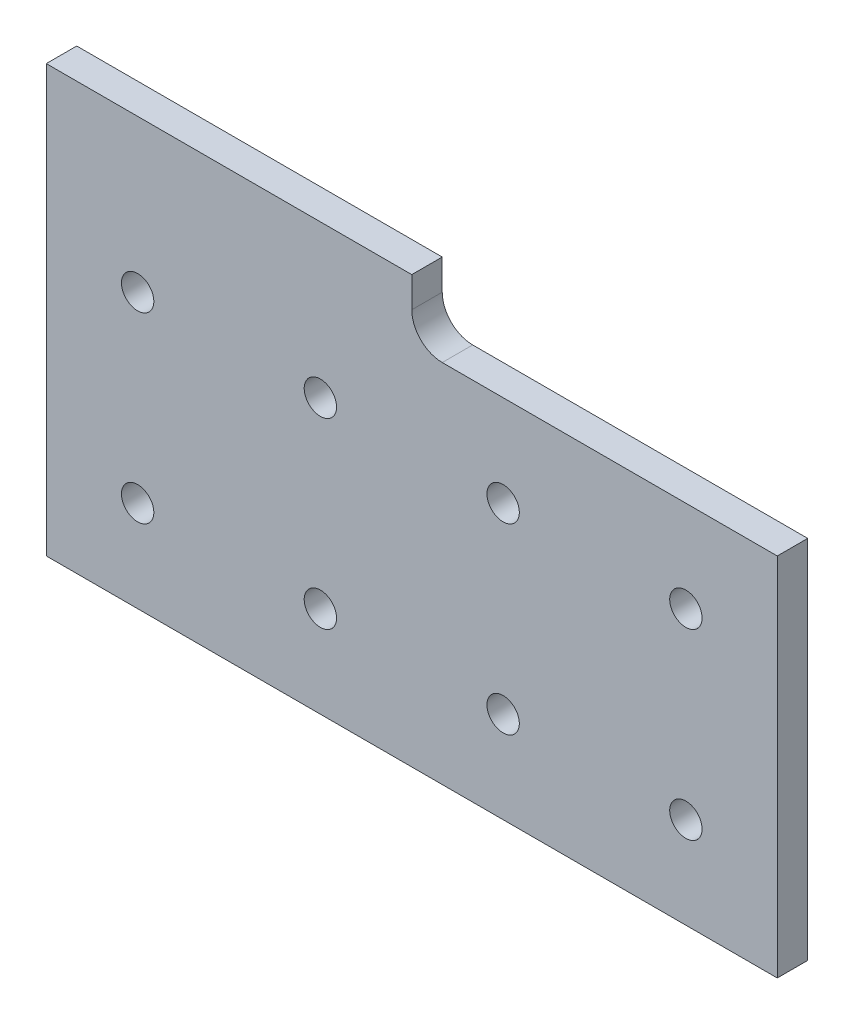
ISO-10303-21;
HEADER;
FILE_DESCRIPTION(('STEP AP214'),'2;1');
FILE_NAME('part.step','',(''),(''),'','','');
FILE_SCHEMA(('AUTOMOTIVE_DESIGN { 1 0 10303 214 1 1 1 1 }'));
ENDSEC;
DATA;
#1=APPLICATION_CONTEXT('core data for automotive mechanical design processes');
#2=APPLICATION_PROTOCOL_DEFINITION('international standard','automotive_design',2000,#1);
#3=PRODUCT_CONTEXT('',#1,'mechanical');
#4=PRODUCT('Part','Part','',(#3));
#5=PRODUCT_RELATED_PRODUCT_CATEGORY('part','',(#4));
#6=PRODUCT_DEFINITION_FORMATION('','',#4);
#7=PRODUCT_DEFINITION_CONTEXT('part definition',#1,'design');
#8=PRODUCT_DEFINITION('design','',#6,#7);
#9=PRODUCT_DEFINITION_SHAPE('','',#8);
#10=(LENGTH_UNIT() NAMED_UNIT(*) SI_UNIT(.MILLI.,.METRE.));
#11=(NAMED_UNIT(*) PLANE_ANGLE_UNIT() SI_UNIT($,.RADIAN.));
#12=(NAMED_UNIT(*) SI_UNIT($,.STERADIAN.) SOLID_ANGLE_UNIT());
#13=UNCERTAINTY_MEASURE_WITH_UNIT(LENGTH_MEASURE(1.E-05),#10,'distance_accuracy_value','');
#14=(GEOMETRIC_REPRESENTATION_CONTEXT(3) GLOBAL_UNCERTAINTY_ASSIGNED_CONTEXT((#13)) GLOBAL_UNIT_ASSIGNED_CONTEXT((#10,
#11,#12)) REPRESENTATION_CONTEXT('',''));
#15=CARTESIAN_POINT('',(0.,0.,0.));
#16=DIRECTION('',(0.,0.,1.));
#17=DIRECTION('',(1.,0.,0.));
#18=AXIS2_PLACEMENT_3D('',#15,#16,#17);
#19=CARTESIAN_POINT('',(133.35,57.15,6.35));
#20=DIRECTION('',(0.,0.,1.));
#21=DIRECTION('',(1.,0.,0.));
#22=AXIS2_PLACEMENT_3D('',#19,#20,#21);
#23=CYLINDRICAL_SURFACE('',#22,3.373501);
#24=CARTESIAN_POINT('',(133.35,57.15,0.));
#25=DIRECTION('',(0.,0.,1.));
#26=DIRECTION('',(1.,0.,0.));
#27=AXIS2_PLACEMENT_3D('',#24,#25,#26);
#28=CIRCLE('',#27,3.373501);
#29=CARTESIAN_POINT('',(136.723501,57.15,0.));
#30=VERTEX_POINT('',#29);
#31=EDGE_CURVE('E192',#30,#30,#28,.T.);
#32=ORIENTED_EDGE('',*,*,#31,.F.);
#33=EDGE_LOOP('',(#32));
#34=FACE_BOUND('',#33,.T.);
#35=CARTESIAN_POINT('',(133.35,57.15,6.35));
#36=DIRECTION('',(0.,0.,1.));
#37=DIRECTION('',(1.,0.,0.));
#38=AXIS2_PLACEMENT_3D('',#35,#36,#37);
#39=CIRCLE('',#38,3.373501);
#40=CARTESIAN_POINT('',(136.723501,57.15,6.35));
#41=VERTEX_POINT('',#40);
#42=EDGE_CURVE('E196',#41,#41,#39,.T.);
#43=ORIENTED_EDGE('',*,*,#42,.T.);
#44=EDGE_LOOP('',(#43));
#45=FACE_BOUND('',#44,.T.);
#46=ADVANCED_FACE('F43',(#34,#45),#23,.F.);
#47=CARTESIAN_POINT('',(95.25,57.15,6.35));
#48=DIRECTION('',(0.,0.,1.));
#49=DIRECTION('',(1.,0.,0.));
#50=AXIS2_PLACEMENT_3D('',#47,#48,#49);
#51=CYLINDRICAL_SURFACE('',#50,3.373501);
#52=CARTESIAN_POINT('',(95.25,57.15,0.));
#53=DIRECTION('',(0.,0.,1.));
#54=DIRECTION('',(1.,0.,0.));
#55=AXIS2_PLACEMENT_3D('',#52,#53,#54);
#56=CIRCLE('',#55,3.373501);
#57=CARTESIAN_POINT('',(98.623501,57.15,0.));
#58=VERTEX_POINT('',#57);
#59=EDGE_CURVE('E184',#58,#58,#56,.T.);
#60=ORIENTED_EDGE('',*,*,#59,.F.);
#61=EDGE_LOOP('',(#60));
#62=FACE_BOUND('',#61,.T.);
#63=CARTESIAN_POINT('',(95.25,57.15,6.35));
#64=DIRECTION('',(0.,0.,1.));
#65=DIRECTION('',(1.,0.,0.));
#66=AXIS2_PLACEMENT_3D('',#63,#64,#65);
#67=CIRCLE('',#66,3.373501);
#68=CARTESIAN_POINT('',(98.623501,57.15,6.35));
#69=VERTEX_POINT('',#68);
#70=EDGE_CURVE('E188',#69,#69,#67,.T.);
#71=ORIENTED_EDGE('',*,*,#70,.T.);
#72=EDGE_LOOP('',(#71));
#73=FACE_BOUND('',#72,.T.);
#74=ADVANCED_FACE('F304',(#62,#73),#51,.F.);
#75=CARTESIAN_POINT('',(57.15,57.15,6.35));
#76=DIRECTION('',(0.,0.,1.));
#77=DIRECTION('',(1.,0.,0.));
#78=AXIS2_PLACEMENT_3D('',#75,#76,#77);
#79=CYLINDRICAL_SURFACE('',#78,3.373501);
#80=CARTESIAN_POINT('',(57.15,57.15,0.));
#81=DIRECTION('',(0.,0.,1.));
#82=DIRECTION('',(1.,0.,0.));
#83=AXIS2_PLACEMENT_3D('',#80,#81,#82);
#84=CIRCLE('',#83,3.373501);
#85=CARTESIAN_POINT('',(60.523501,57.15,0.));
#86=VERTEX_POINT('',#85);
#87=EDGE_CURVE('E176',#86,#86,#84,.T.);
#88=ORIENTED_EDGE('',*,*,#87,.F.);
#89=EDGE_LOOP('',(#88));
#90=FACE_BOUND('',#89,.T.);
#91=CARTESIAN_POINT('',(57.15,57.15,6.35));
#92=DIRECTION('',(0.,0.,1.));
#93=DIRECTION('',(1.,0.,0.));
#94=AXIS2_PLACEMENT_3D('',#91,#92,#93);
#95=CIRCLE('',#94,3.373501);
#96=CARTESIAN_POINT('',(60.523501,57.15,6.35));
#97=VERTEX_POINT('',#96);
#98=EDGE_CURVE('E180',#97,#97,#95,.T.);
#99=ORIENTED_EDGE('',*,*,#98,.T.);
#100=EDGE_LOOP('',(#99));
#101=FACE_BOUND('',#100,.T.);
#102=ADVANCED_FACE('F309',(#90,#101),#79,.F.);
#103=CARTESIAN_POINT('',(19.05,57.15,6.35));
#104=DIRECTION('',(0.,0.,1.));
#105=DIRECTION('',(1.,0.,0.));
#106=AXIS2_PLACEMENT_3D('',#103,#104,#105);
#107=CYLINDRICAL_SURFACE('',#106,3.373501);
#108=CARTESIAN_POINT('',(19.05,57.15,0.));
#109=DIRECTION('',(0.,0.,1.));
#110=DIRECTION('',(1.,0.,0.));
#111=AXIS2_PLACEMENT_3D('',#108,#109,#110);
#112=CIRCLE('',#111,3.373501);
#113=CARTESIAN_POINT('',(22.423501,57.15,0.));
#114=VERTEX_POINT('',#113);
#115=EDGE_CURVE('E168',#114,#114,#112,.T.);
#116=ORIENTED_EDGE('',*,*,#115,.F.);
#117=EDGE_LOOP('',(#116));
#118=FACE_BOUND('',#117,.T.);
#119=CARTESIAN_POINT('',(19.05,57.15,6.35));
#120=DIRECTION('',(0.,0.,1.));
#121=DIRECTION('',(1.,0.,0.));
#122=AXIS2_PLACEMENT_3D('',#119,#120,#121);
#123=CIRCLE('',#122,3.373501);
#124=CARTESIAN_POINT('',(22.423501,57.15,6.35));
#125=VERTEX_POINT('',#124);
#126=EDGE_CURVE('E172',#125,#125,#123,.T.);
#127=ORIENTED_EDGE('',*,*,#126,.T.);
#128=EDGE_LOOP('',(#127));
#129=FACE_BOUND('',#128,.T.);
#130=ADVANCED_FACE('F316',(#118,#129),#107,.F.);
#131=CARTESIAN_POINT('',(133.35,19.05,6.35));
#132=DIRECTION('',(0.,0.,1.));
#133=DIRECTION('',(1.,0.,0.));
#134=AXIS2_PLACEMENT_3D('',#131,#132,#133);
#135=CYLINDRICAL_SURFACE('',#134,3.373501);
#136=CARTESIAN_POINT('',(133.35,19.05,0.));
#137=DIRECTION('',(0.,0.,1.));
#138=DIRECTION('',(1.,0.,0.));
#139=AXIS2_PLACEMENT_3D('',#136,#137,#138);
#140=CIRCLE('',#139,3.373501);
#141=CARTESIAN_POINT('',(136.723501,19.05,0.));
#142=VERTEX_POINT('',#141);
#143=EDGE_CURVE('E160',#142,#142,#140,.T.);
#144=ORIENTED_EDGE('',*,*,#143,.F.);
#145=EDGE_LOOP('',(#144));
#146=FACE_BOUND('',#145,.T.);
#147=CARTESIAN_POINT('',(133.35,19.05,6.35));
#148=DIRECTION('',(0.,0.,1.));
#149=DIRECTION('',(1.,0.,0.));
#150=AXIS2_PLACEMENT_3D('',#147,#148,#149);
#151=CIRCLE('',#150,3.373501);
#152=CARTESIAN_POINT('',(136.723501,19.05,6.35));
#153=VERTEX_POINT('',#152);
#154=EDGE_CURVE('E164',#153,#153,#151,.T.);
#155=ORIENTED_EDGE('',*,*,#154,.T.);
#156=EDGE_LOOP('',(#155));
#157=FACE_BOUND('',#156,.T.);
#158=ADVANCED_FACE('F320',(#146,#157),#135,.F.);
#159=CARTESIAN_POINT('',(95.25,19.05,6.35));
#160=DIRECTION('',(0.,0.,1.));
#161=DIRECTION('',(1.,0.,0.));
#162=AXIS2_PLACEMENT_3D('',#159,#160,#161);
#163=CYLINDRICAL_SURFACE('',#162,3.373501);
#164=CARTESIAN_POINT('',(95.25,19.05,0.));
#165=DIRECTION('',(0.,0.,1.));
#166=DIRECTION('',(1.,0.,0.));
#167=AXIS2_PLACEMENT_3D('',#164,#165,#166);
#168=CIRCLE('',#167,3.373501);
#169=CARTESIAN_POINT('',(98.623501,19.05,0.));
#170=VERTEX_POINT('',#169);
#171=EDGE_CURVE('E152',#170,#170,#168,.T.);
#172=ORIENTED_EDGE('',*,*,#171,.F.);
#173=EDGE_LOOP('',(#172));
#174=FACE_BOUND('',#173,.T.);
#175=CARTESIAN_POINT('',(95.25,19.05,6.35));
#176=DIRECTION('',(0.,0.,1.));
#177=DIRECTION('',(1.,0.,0.));
#178=AXIS2_PLACEMENT_3D('',#175,#176,#177);
#179=CIRCLE('',#178,3.373501);
#180=CARTESIAN_POINT('',(98.623501,19.05,6.35));
#181=VERTEX_POINT('',#180);
#182=EDGE_CURVE('E156',#181,#181,#179,.T.);
#183=ORIENTED_EDGE('',*,*,#182,.T.);
#184=EDGE_LOOP('',(#183));
#185=FACE_BOUND('',#184,.T.);
#186=ADVANCED_FACE('F324',(#174,#185),#163,.F.);
#187=CARTESIAN_POINT('',(0.,88.9,6.35));
#188=DIRECTION('',(1.,0.,0.));
#189=DIRECTION('',(0.,0.,-1.));
#190=AXIS2_PLACEMENT_3D('',#187,#188,#189);
#191=PLANE('',#190);
#192=DIRECTION('',(0.,-1.,0.));
#193=VECTOR('',#192,1.);
#194=CARTESIAN_POINT('',(0.,88.9,0.));
#195=LINE('',#194,#193);
#196=CARTESIAN_POINT('',(0.,88.9,0.));
#197=VERTEX_POINT('',#196);
#198=CARTESIAN_POINT('',(0.,0.,0.));
#199=VERTEX_POINT('',#198);
#200=EDGE_CURVE('E125',#197,#199,#195,.T.);
#201=ORIENTED_EDGE('',*,*,#200,.T.);
#202=DIRECTION('',(0.,0.,-1.));
#203=VECTOR('',#202,1.);
#204=CARTESIAN_POINT('',(0.,0.,6.35));
#205=LINE('',#204,#203);
#206=CARTESIAN_POINT('',(0.,0.,6.35));
#207=VERTEX_POINT('',#206);
#208=EDGE_CURVE('E148',#207,#199,#205,.T.);
#209=ORIENTED_EDGE('',*,*,#208,.F.);
#210=DIRECTION('',(0.,-1.,0.));
#211=VECTOR('',#210,1.);
#212=CARTESIAN_POINT('',(0.,88.9,6.35));
#213=LINE('',#212,#211);
#214=CARTESIAN_POINT('',(0.,88.9,6.35));
#215=VERTEX_POINT('',#214);
#216=EDGE_CURVE('E127',#215,#207,#213,.T.);
#217=ORIENTED_EDGE('',*,*,#216,.F.);
#218=DIRECTION('',(0.,0.,-1.));
#219=VECTOR('',#218,1.);
#220=CARTESIAN_POINT('',(0.,88.9,6.35));
#221=LINE('',#220,#219);
#222=EDGE_CURVE('E141',#215,#197,#221,.T.);
#223=ORIENTED_EDGE('',*,*,#222,.T.);
#224=EDGE_LOOP('',(#201,#209,#217,#223));
#225=FACE_BOUND('',#224,.T.);
#226=ADVANCED_FACE('F328',(#225),#191,.F.);
#227=CARTESIAN_POINT('',(0.,0.,6.35));
#228=DIRECTION('',(0.,1.,0.));
#229=DIRECTION('',(0.,0.,1.));
#230=AXIS2_PLACEMENT_3D('',#227,#228,#229);
#231=PLANE('',#230);
#232=DIRECTION('',(1.,0.,0.));
#233=VECTOR('',#232,1.);
#234=CARTESIAN_POINT('',(0.,0.,0.));
#235=LINE('',#234,#233);
#236=CARTESIAN_POINT('',(152.4,0.,0.));
#237=VERTEX_POINT('',#236);
#238=EDGE_CURVE('E137',#199,#237,#235,.T.);
#239=ORIENTED_EDGE('',*,*,#238,.T.);
#240=DIRECTION('',(0.,0.,-1.));
#241=VECTOR('',#240,1.);
#242=CARTESIAN_POINT('',(152.4,0.,6.35));
#243=LINE('',#242,#241);
#244=CARTESIAN_POINT('',(152.4,0.,6.35));
#245=VERTEX_POINT('',#244);
#246=EDGE_CURVE('E144',#245,#237,#243,.T.);
#247=ORIENTED_EDGE('',*,*,#246,.F.);
#248=DIRECTION('',(1.,0.,0.));
#249=VECTOR('',#248,1.);
#250=CARTESIAN_POINT('',(0.,0.,6.35));
#251=LINE('',#250,#249);
#252=EDGE_CURVE('E134',#207,#245,#251,.T.);
#253=ORIENTED_EDGE('',*,*,#252,.F.);
#254=ORIENTED_EDGE('',*,*,#208,.T.);
#255=EDGE_LOOP('',(#239,#247,#253,#254));
#256=FACE_BOUND('',#255,.T.);
#257=ADVANCED_FACE('F245',(#256),#231,.F.);
#258=CARTESIAN_POINT('',(152.4,0.,6.35));
#259=DIRECTION('',(-1.,0.,0.));
#260=DIRECTION('',(0.,0.,1.));
#261=AXIS2_PLACEMENT_3D('',#258,#259,#260);
#262=PLANE('',#261);
#263=DIRECTION('',(0.,1.,0.));
#264=VECTOR('',#263,1.);
#265=CARTESIAN_POINT('',(152.4,0.,0.));
#266=LINE('',#265,#264);
#267=CARTESIAN_POINT('',(152.4,76.2,0.));
#268=VERTEX_POINT('',#267);
#269=EDGE_CURVE('E128',#237,#268,#266,.T.);
#270=ORIENTED_EDGE('',*,*,#269,.T.);
#271=DIRECTION('',(0.,0.,1.));
#272=VECTOR('',#271,1.);
#273=CARTESIAN_POINT('',(152.4,76.2,0.));
#274=LINE('',#273,#272);
#275=CARTESIAN_POINT('',(152.4,76.2,6.35));
#276=VERTEX_POINT('',#275);
#277=EDGE_CURVE('E119',#268,#276,#274,.T.);
#278=ORIENTED_EDGE('',*,*,#277,.T.);
#279=DIRECTION('',(0.,1.,0.));
#280=VECTOR('',#279,1.);
#281=CARTESIAN_POINT('',(152.4,0.,6.35));
#282=LINE('',#281,#280);
#283=EDGE_CURVE('E228',#245,#276,#282,.T.);
#284=ORIENTED_EDGE('',*,*,#283,.F.);
#285=ORIENTED_EDGE('',*,*,#246,.T.);
#286=EDGE_LOOP('',(#270,#278,#284,#285));
#287=FACE_BOUND('',#286,.T.);
#288=ADVANCED_FACE('F250',(#287),#262,.F.);
#289=CARTESIAN_POINT('',(152.4,88.9,6.35));
#290=DIRECTION('',(0.,-1.,0.));
#291=DIRECTION('',(1.,0.,0.));
#292=AXIS2_PLACEMENT_3D('',#289,#290,#291);
#293=PLANE('',#292);
#294=DIRECTION('',(-1.,0.,0.));
#295=VECTOR('',#294,1.);
#296=CARTESIAN_POINT('',(152.4,88.9,6.35));
#297=LINE('',#296,#295);
#298=CARTESIAN_POINT('',(76.2,88.9,6.35));
#299=VERTEX_POINT('',#298);
#300=EDGE_CURVE('E116',#299,#215,#297,.T.);
#301=ORIENTED_EDGE('',*,*,#300,.F.);
#302=DIRECTION('',(0.,0.,1.));
#303=VECTOR('',#302,1.);
#304=CARTESIAN_POINT('',(76.2,88.9,0.));
#305=LINE('',#304,#303);
#306=CARTESIAN_POINT('',(76.2,88.9,0.));
#307=VERTEX_POINT('',#306);
#308=EDGE_CURVE('E102',#307,#299,#305,.T.);
#309=ORIENTED_EDGE('',*,*,#308,.F.);
#310=DIRECTION('',(-1.,0.,0.));
#311=VECTOR('',#310,1.);
#312=CARTESIAN_POINT('',(152.4,88.9,0.));
#313=LINE('',#312,#311);
#314=EDGE_CURVE('E114',#307,#197,#313,.T.);
#315=ORIENTED_EDGE('',*,*,#314,.T.);
#316=ORIENTED_EDGE('',*,*,#222,.F.);
#317=EDGE_LOOP('',(#301,#309,#315,#316));
#318=FACE_BOUND('',#317,.T.);
#319=ADVANCED_FACE('F112',(#318),#293,.F.);
#320=CARTESIAN_POINT('',(0.,0.,6.35));
#321=DIRECTION('',(0.,0.,1.));
#322=DIRECTION('',(1.,0.,0.));
#323=AXIS2_PLACEMENT_3D('',#320,#321,#322);
#324=PLANE('',#323);
#325=DIRECTION('',(0.,-1.,0.));
#326=VECTOR('',#325,1.);
#327=CARTESIAN_POINT('',(76.2,88.9,6.35));
#328=LINE('',#327,#326);
#329=CARTESIAN_POINT('',(76.2,82.55,6.35));
#330=VERTEX_POINT('',#329);
#331=EDGE_CURVE('E356',#299,#330,#328,.T.);
#332=ORIENTED_EDGE('',*,*,#331,.F.);
#333=ORIENTED_EDGE('',*,*,#300,.T.);
#334=ORIENTED_EDGE('',*,*,#216,.T.);
#335=ORIENTED_EDGE('',*,*,#252,.T.);
#336=ORIENTED_EDGE('',*,*,#283,.T.);
#337=DIRECTION('',(1.,0.,0.));
#338=VECTOR('',#337,1.);
#339=CARTESIAN_POINT('',(76.2,76.2,6.35));
#340=LINE('',#339,#338);
#341=CARTESIAN_POINT('',(82.55,76.2,6.35));
#342=VERTEX_POINT('',#341);
#343=EDGE_CURVE('E108',#342,#276,#340,.T.);
#344=ORIENTED_EDGE('',*,*,#343,.F.);
#345=CARTESIAN_POINT('',(82.55,82.55,6.35));
#346=DIRECTION('',(0.,0.,1.));
#347=DIRECTION('',(1.,0.,0.));
#348=AXIS2_PLACEMENT_3D('',#345,#346,#347);
#349=CIRCLE('',#348,6.35);
#350=EDGE_CURVE('E52',#342,#330,#349,.F.);
#351=ORIENTED_EDGE('',*,*,#350,.T.);
#352=EDGE_LOOP('',(#332,#333,#334,#335,#336,#344,#351));
#353=FACE_BOUND('',#352,.T.);
#354=CARTESIAN_POINT('',(57.15,19.05,6.35));
#355=DIRECTION('',(0.,0.,1.));
#356=DIRECTION('',(1.,0.,0.));
#357=AXIS2_PLACEMENT_3D('',#354,#355,#356);
#358=CIRCLE('',#357,3.373501);
#359=CARTESIAN_POINT('',(60.523501,19.05,6.35));
#360=VERTEX_POINT('',#359);
#361=EDGE_CURVE('E267',#360,#360,#358,.T.);
#362=ORIENTED_EDGE('',*,*,#361,.F.);
#363=EDGE_LOOP('',(#362));
#364=FACE_BOUND('',#363,.T.);
#365=CARTESIAN_POINT('',(19.05,19.05,6.35));
#366=DIRECTION('',(0.,0.,1.));
#367=DIRECTION('',(1.,0.,0.));
#368=AXIS2_PLACEMENT_3D('',#365,#366,#367);
#369=CIRCLE('',#368,3.373501);
#370=CARTESIAN_POINT('',(22.423501,19.05,6.35));
#371=VERTEX_POINT('',#370);
#372=EDGE_CURVE('E271',#371,#371,#369,.T.);
#373=ORIENTED_EDGE('',*,*,#372,.F.);
#374=EDGE_LOOP('',(#373));
#375=FACE_BOUND('',#374,.T.);
#376=ORIENTED_EDGE('',*,*,#182,.F.);
#377=EDGE_LOOP('',(#376));
#378=FACE_BOUND('',#377,.T.);
#379=ORIENTED_EDGE('',*,*,#154,.F.);
#380=EDGE_LOOP('',(#379));
#381=FACE_BOUND('',#380,.T.);
#382=ORIENTED_EDGE('',*,*,#126,.F.);
#383=EDGE_LOOP('',(#382));
#384=FACE_BOUND('',#383,.T.);
#385=ORIENTED_EDGE('',*,*,#98,.F.);
#386=EDGE_LOOP('',(#385));
#387=FACE_BOUND('',#386,.T.);
#388=ORIENTED_EDGE('',*,*,#70,.F.);
#389=EDGE_LOOP('',(#388));
#390=FACE_BOUND('',#389,.T.);
#391=ORIENTED_EDGE('',*,*,#42,.F.);
#392=EDGE_LOOP('',(#391));
#393=FACE_BOUND('',#392,.T.);
#394=ADVANCED_FACE('F287',(#353,#364,#375,#378,#381,#384,#387,#390,#393),#324,.T.);
#395=CARTESIAN_POINT('',(0.,0.,0.));
#396=DIRECTION('',(0.,0.,1.));
#397=DIRECTION('',(1.,0.,0.));
#398=AXIS2_PLACEMENT_3D('',#395,#396,#397);
#399=PLANE('',#398);
#400=CARTESIAN_POINT('',(57.15,19.05,0.));
#401=DIRECTION('',(0.,0.,1.));
#402=DIRECTION('',(1.,0.,0.));
#403=AXIS2_PLACEMENT_3D('',#400,#401,#402);
#404=CIRCLE('',#403,3.373501);
#405=CARTESIAN_POINT('',(60.523501,19.05,0.));
#406=VERTEX_POINT('',#405);
#407=EDGE_CURVE('E118',#406,#406,#404,.T.);
#408=ORIENTED_EDGE('',*,*,#407,.T.);
#409=EDGE_LOOP('',(#408));
#410=FACE_BOUND('',#409,.T.);
#411=CARTESIAN_POINT('',(19.05,19.05,0.));
#412=DIRECTION('',(0.,0.,1.));
#413=DIRECTION('',(1.,0.,0.));
#414=AXIS2_PLACEMENT_3D('',#411,#412,#413);
#415=CIRCLE('',#414,3.373501);
#416=CARTESIAN_POINT('',(22.423501,19.05,0.));
#417=VERTEX_POINT('',#416);
#418=EDGE_CURVE('E241',#417,#417,#415,.T.);
#419=ORIENTED_EDGE('',*,*,#418,.T.);
#420=EDGE_LOOP('',(#419));
#421=FACE_BOUND('',#420,.T.);
#422=ORIENTED_EDGE('',*,*,#314,.F.);
#423=DIRECTION('',(0.,-1.,0.));
#424=VECTOR('',#423,1.);
#425=CARTESIAN_POINT('',(76.2,88.9,0.));
#426=LINE('',#425,#424);
#427=CARTESIAN_POINT('',(76.2,82.55,0.));
#428=VERTEX_POINT('',#427);
#429=EDGE_CURVE('E99',#307,#428,#426,.T.);
#430=ORIENTED_EDGE('',*,*,#429,.T.);
#431=CARTESIAN_POINT('',(82.55,82.55,0.));
#432=DIRECTION('',(0.,0.,1.));
#433=DIRECTION('',(1.,0.,0.));
#434=AXIS2_PLACEMENT_3D('',#431,#432,#433);
#435=CIRCLE('',#434,6.35);
#436=CARTESIAN_POINT('',(82.55,76.2,0.));
#437=VERTEX_POINT('',#436);
#438=EDGE_CURVE('E11',#428,#437,#435,.T.);
#439=ORIENTED_EDGE('',*,*,#438,.T.);
#440=DIRECTION('',(1.,0.,0.));
#441=VECTOR('',#440,1.);
#442=CARTESIAN_POINT('',(76.2,76.2,0.));
#443=LINE('',#442,#441);
#444=EDGE_CURVE('E107',#437,#268,#443,.T.);
#445=ORIENTED_EDGE('',*,*,#444,.T.);
#446=ORIENTED_EDGE('',*,*,#269,.F.);
#447=ORIENTED_EDGE('',*,*,#238,.F.);
#448=ORIENTED_EDGE('',*,*,#200,.F.);
#449=EDGE_LOOP('',(#422,#430,#439,#445,#446,#447,#448));
#450=FACE_BOUND('',#449,.T.);
#451=ORIENTED_EDGE('',*,*,#171,.T.);
#452=EDGE_LOOP('',(#451));
#453=FACE_BOUND('',#452,.T.);
#454=ORIENTED_EDGE('',*,*,#143,.T.);
#455=EDGE_LOOP('',(#454));
#456=FACE_BOUND('',#455,.T.);
#457=ORIENTED_EDGE('',*,*,#115,.T.);
#458=EDGE_LOOP('',(#457));
#459=FACE_BOUND('',#458,.T.);
#460=ORIENTED_EDGE('',*,*,#87,.T.);
#461=EDGE_LOOP('',(#460));
#462=FACE_BOUND('',#461,.T.);
#463=ORIENTED_EDGE('',*,*,#59,.T.);
#464=EDGE_LOOP('',(#463));
#465=FACE_BOUND('',#464,.T.);
#466=ORIENTED_EDGE('',*,*,#31,.T.);
#467=EDGE_LOOP('',(#466));
#468=FACE_BOUND('',#467,.T.);
#469=ADVANCED_FACE('F122',(#410,#421,#450,#453,#456,#459,#462,#465,#468),#399,.F.);
#470=CARTESIAN_POINT('',(19.05,19.05,6.35));
#471=DIRECTION('',(0.,0.,1.));
#472=DIRECTION('',(1.,0.,0.));
#473=AXIS2_PLACEMENT_3D('',#470,#471,#472);
#474=CYLINDRICAL_SURFACE('',#473,3.373501);
#475=ORIENTED_EDGE('',*,*,#418,.F.);
#476=EDGE_LOOP('',(#475));
#477=FACE_BOUND('',#476,.T.);
#478=ORIENTED_EDGE('',*,*,#372,.T.);
#479=EDGE_LOOP('',(#478));
#480=FACE_BOUND('',#479,.T.);
#481=ADVANCED_FACE('F280',(#477,#480),#474,.F.);
#482=CARTESIAN_POINT('',(57.15,19.05,6.35));
#483=DIRECTION('',(0.,0.,1.));
#484=DIRECTION('',(1.,0.,0.));
#485=AXIS2_PLACEMENT_3D('',#482,#483,#484);
#486=CYLINDRICAL_SURFACE('',#485,3.373501);
#487=ORIENTED_EDGE('',*,*,#407,.F.);
#488=EDGE_LOOP('',(#487));
#489=FACE_BOUND('',#488,.T.);
#490=ORIENTED_EDGE('',*,*,#361,.T.);
#491=EDGE_LOOP('',(#490));
#492=FACE_BOUND('',#491,.T.);
#493=ADVANCED_FACE('F283',(#489,#492),#486,.F.);
#494=CARTESIAN_POINT('',(76.2,88.9,0.));
#495=DIRECTION('',(-1.,0.,0.));
#496=DIRECTION('',(0.,0.,1.));
#497=AXIS2_PLACEMENT_3D('',#494,#495,#496);
#498=PLANE('',#497);
#499=ORIENTED_EDGE('',*,*,#331,.T.);
#500=DIRECTION('',(0.,0.,1.));
#501=VECTOR('',#500,1.);
#502=CARTESIAN_POINT('',(76.2,82.55,0.));
#503=LINE('',#502,#501);
#504=EDGE_CURVE('E59',#330,#428,#503,.F.);
#505=ORIENTED_EDGE('',*,*,#504,.T.);
#506=ORIENTED_EDGE('',*,*,#429,.F.);
#507=ORIENTED_EDGE('',*,*,#308,.T.);
#508=EDGE_LOOP('',(#499,#505,#506,#507));
#509=FACE_BOUND('',#508,.T.);
#510=ADVANCED_FACE('F101',(#509),#498,.F.);
#511=CARTESIAN_POINT('',(76.2,76.2,0.));
#512=DIRECTION('',(0.,-1.,0.));
#513=DIRECTION('',(0.,0.,-1.));
#514=AXIS2_PLACEMENT_3D('',#511,#512,#513);
#515=PLANE('',#514);
#516=ORIENTED_EDGE('',*,*,#444,.F.);
#517=DIRECTION('',(0.,0.,1.));
#518=VECTOR('',#517,1.);
#519=CARTESIAN_POINT('',(82.55,76.2,6.35));
#520=LINE('',#519,#518);
#521=EDGE_CURVE('E200',#437,#342,#520,.T.);
#522=ORIENTED_EDGE('',*,*,#521,.T.);
#523=ORIENTED_EDGE('',*,*,#343,.T.);
#524=ORIENTED_EDGE('',*,*,#277,.F.);
#525=EDGE_LOOP('',(#516,#522,#523,#524));
#526=FACE_BOUND('',#525,.T.);
#527=ADVANCED_FACE('F258',(#526),#515,.F.);
#528=CARTESIAN_POINT('',(82.55,82.55,0.));
#529=DIRECTION('',(0.,0.,-1.));
#530=DIRECTION('',(-1.,0.,0.));
#531=AXIS2_PLACEMENT_3D('',#528,#529,#530);
#532=CYLINDRICAL_SURFACE('',#531,6.35);
#533=ORIENTED_EDGE('',*,*,#438,.F.);
#534=ORIENTED_EDGE('',*,*,#504,.F.);
#535=ORIENTED_EDGE('',*,*,#350,.F.);
#536=ORIENTED_EDGE('',*,*,#521,.F.);
#537=EDGE_LOOP('',(#533,#534,#535,#536));
#538=FACE_BOUND('',#537,.T.);
#539=ADVANCED_FACE('F45',(#538),#532,.F.);
#540=CLOSED_SHELL('',(#46,#74,#102,#130,#158,#186,#226,#257,#288,#319,#394,#469,#481,#493,#510,
#527,#539));
#541=MANIFOLD_SOLID_BREP('B2',#540);
#542=ADVANCED_BREP_SHAPE_REPRESENTATION('',(#18,#541),#14);
#543=SHAPE_DEFINITION_REPRESENTATION(#9,#542);
ENDSEC;
END-ISO-10303-21;
